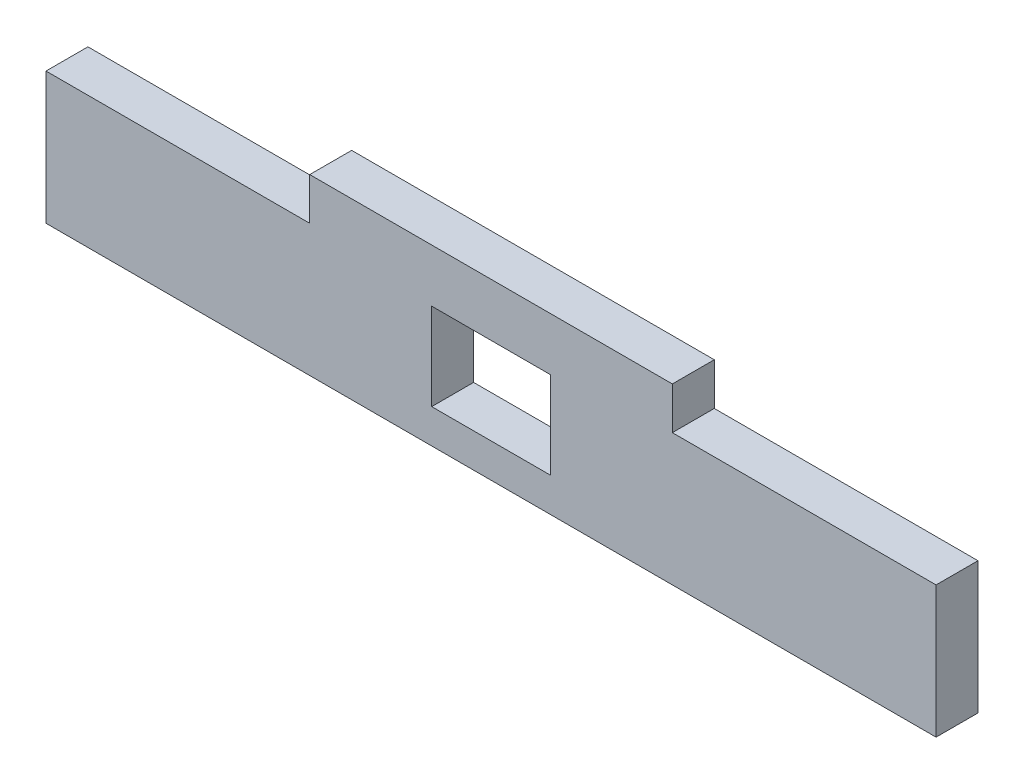
ISO-10303-21;
HEADER;
FILE_DESCRIPTION(('STEP AP214'),'2;1');
FILE_NAME('part.step','',(''),(''),'','','');
FILE_SCHEMA(('AUTOMOTIVE_DESIGN { 1 0 10303 214 1 1 1 1 }'));
ENDSEC;
DATA;
#1=APPLICATION_CONTEXT('core data for automotive mechanical design processes');
#2=APPLICATION_PROTOCOL_DEFINITION('international standard','automotive_design',2000,#1);
#3=PRODUCT_CONTEXT('',#1,'mechanical');
#4=PRODUCT('Part','Part','',(#3));
#5=PRODUCT_RELATED_PRODUCT_CATEGORY('part','',(#4));
#6=PRODUCT_DEFINITION_FORMATION('','',#4);
#7=PRODUCT_DEFINITION_CONTEXT('part definition',#1,'design');
#8=PRODUCT_DEFINITION('design','',#6,#7);
#9=PRODUCT_DEFINITION_SHAPE('','',#8);
#10=(LENGTH_UNIT() NAMED_UNIT(*) SI_UNIT(.MILLI.,.METRE.));
#11=(NAMED_UNIT(*) PLANE_ANGLE_UNIT() SI_UNIT($,.RADIAN.));
#12=(NAMED_UNIT(*) SI_UNIT($,.STERADIAN.) SOLID_ANGLE_UNIT());
#13=UNCERTAINTY_MEASURE_WITH_UNIT(LENGTH_MEASURE(1.E-05),#10,'distance_accuracy_value','');
#14=(GEOMETRIC_REPRESENTATION_CONTEXT(3) GLOBAL_UNCERTAINTY_ASSIGNED_CONTEXT((#13)) GLOBAL_UNIT_ASSIGNED_CONTEXT((#10,
#11,#12)) REPRESENTATION_CONTEXT('',''));
#15=CARTESIAN_POINT('',(0.,0.,0.));
#16=DIRECTION('',(0.,0.,1.));
#17=DIRECTION('',(1.,0.,0.));
#18=AXIS2_PLACEMENT_3D('',#15,#16,#17);
#19=CARTESIAN_POINT('',(0.,0.,4.0386));
#20=DIRECTION('',(0.,0.,1.));
#21=DIRECTION('',(1.,0.,0.));
#22=AXIS2_PLACEMENT_3D('',#19,#20,#21);
#23=PLANE('',#22);
#24=DIRECTION('',(0.,-1.,0.));
#25=VECTOR('',#24,1.);
#26=CARTESIAN_POINT('',(0.,12.7,4.0386));
#27=LINE('',#26,#25);
#28=CARTESIAN_POINT('',(0.,12.7,4.0386));
#29=VERTEX_POINT('',#28);
#30=CARTESIAN_POINT('',(0.,0.,4.0386));
#31=VERTEX_POINT('',#30);
#32=EDGE_CURVE('E158',#29,#31,#27,.T.);
#33=ORIENTED_EDGE('',*,*,#32,.T.);
#34=DIRECTION('',(1.,0.,0.));
#35=VECTOR('',#34,1.);
#36=CARTESIAN_POINT('',(0.,0.,4.0386));
#37=LINE('',#36,#35);
#38=CARTESIAN_POINT('',(85.725,0.,4.0386));
#39=VERTEX_POINT('',#38);
#40=EDGE_CURVE('E161',#31,#39,#37,.T.);
#41=ORIENTED_EDGE('',*,*,#40,.T.);
#42=DIRECTION('',(0.,1.,0.));
#43=VECTOR('',#42,1.);
#44=CARTESIAN_POINT('',(85.725,0.,4.0386));
#45=LINE('',#44,#43);
#46=CARTESIAN_POINT('',(85.725,12.7,4.0386));
#47=VERTEX_POINT('',#46);
#48=EDGE_CURVE('E164',#39,#47,#45,.T.);
#49=ORIENTED_EDGE('',*,*,#48,.T.);
#50=DIRECTION('',(-1.,0.,0.));
#51=VECTOR('',#50,1.);
#52=CARTESIAN_POINT('',(85.725,12.7,4.0386));
#53=LINE('',#52,#51);
#54=CARTESIAN_POINT('',(60.325,12.7,4.0386));
#55=VERTEX_POINT('',#54);
#56=EDGE_CURVE('E166',#47,#55,#53,.T.);
#57=ORIENTED_EDGE('',*,*,#56,.T.);
#58=DIRECTION('',(0.,1.,0.));
#59=VECTOR('',#58,1.);
#60=CARTESIAN_POINT('',(60.325,12.7,4.0386));
#61=LINE('',#60,#59);
#62=CARTESIAN_POINT('',(60.325,16.764,4.0386));
#63=VERTEX_POINT('',#62);
#64=EDGE_CURVE('E168',#55,#63,#61,.T.);
#65=ORIENTED_EDGE('',*,*,#64,.T.);
#66=DIRECTION('',(-1.,0.,0.));
#67=VECTOR('',#66,1.);
#68=CARTESIAN_POINT('',(60.325,16.764,4.0386));
#69=LINE('',#68,#67);
#70=CARTESIAN_POINT('',(25.4,16.764,4.0386));
#71=VERTEX_POINT('',#70);
#72=EDGE_CURVE('E170',#63,#71,#69,.T.);
#73=ORIENTED_EDGE('',*,*,#72,.T.);
#74=DIRECTION('',(0.,-1.,0.));
#75=VECTOR('',#74,1.);
#76=CARTESIAN_POINT('',(25.4,16.764,4.0386));
#77=LINE('',#76,#75);
#78=CARTESIAN_POINT('',(25.4,12.7,4.0386));
#79=VERTEX_POINT('',#78);
#80=EDGE_CURVE('E172',#71,#79,#77,.T.);
#81=ORIENTED_EDGE('',*,*,#80,.T.);
#82=DIRECTION('',(-1.,0.,0.));
#83=VECTOR('',#82,1.);
#84=CARTESIAN_POINT('',(25.4,12.7,4.0386));
#85=LINE('',#84,#83);
#86=EDGE_CURVE('E174',#79,#29,#85,.T.);
#87=ORIENTED_EDGE('',*,*,#86,.T.);
#88=EDGE_LOOP('',(#33,#41,#49,#57,#65,#73,#81,#87));
#89=FACE_BOUND('',#88,.T.);
#90=DIRECTION('',(1.,0.,0.));
#91=VECTOR('',#90,1.);
#92=CARTESIAN_POINT('',(37.1475,3.28290287483415,4.0386));
#93=LINE('',#92,#91);
#94=CARTESIAN_POINT('',(37.1475,3.28290287483415,4.0386));
#95=VERTEX_POINT('',#94);
#96=CARTESIAN_POINT('',(48.5775,3.28290287483415,4.0386));
#97=VERTEX_POINT('',#96);
#98=EDGE_CURVE('E130',#95,#97,#93,.T.);
#99=ORIENTED_EDGE('',*,*,#98,.F.);
#100=DIRECTION('',(0.,-1.,0.));
#101=VECTOR('',#100,1.);
#102=CARTESIAN_POINT('',(37.1475,11.6649028748341,4.0386));
#103=LINE('',#102,#101);
#104=CARTESIAN_POINT('',(37.1475,11.6649028748341,4.0386));
#105=VERTEX_POINT('',#104);
#106=EDGE_CURVE('E122',#105,#95,#103,.T.);
#107=ORIENTED_EDGE('',*,*,#106,.F.);
#108=DIRECTION('',(-1.,0.,0.));
#109=VECTOR('',#108,1.);
#110=CARTESIAN_POINT('',(37.1475,11.6649028748341,4.0386));
#111=LINE('',#110,#109);
#112=CARTESIAN_POINT('',(48.5775,11.6649028748341,4.0386));
#113=VERTEX_POINT('',#112);
#114=EDGE_CURVE('E144',#113,#105,#111,.T.);
#115=ORIENTED_EDGE('',*,*,#114,.F.);
#116=DIRECTION('',(0.,1.,0.));
#117=VECTOR('',#116,1.);
#118=CARTESIAN_POINT('',(48.5775,11.6649028748341,4.0386));
#119=LINE('',#118,#117);
#120=EDGE_CURVE('E142',#97,#113,#119,.T.);
#121=ORIENTED_EDGE('',*,*,#120,.F.);
#122=EDGE_LOOP('',(#99,#107,#115,#121));
#123=FACE_BOUND('',#122,.T.);
#124=ADVANCED_FACE('F33',(#89,#123),#23,.T.);
#125=CARTESIAN_POINT('',(0.,0.,0.));
#126=DIRECTION('',(0.,0.,1.));
#127=DIRECTION('',(1.,0.,0.));
#128=AXIS2_PLACEMENT_3D('',#125,#126,#127);
#129=PLANE('',#128);
#130=DIRECTION('',(0.,-1.,0.));
#131=VECTOR('',#130,1.);
#132=CARTESIAN_POINT('',(0.,12.7,0.));
#133=LINE('',#132,#131);
#134=CARTESIAN_POINT('',(0.,12.7,0.));
#135=VERTEX_POINT('',#134);
#136=CARTESIAN_POINT('',(0.,0.,0.));
#137=VERTEX_POINT('',#136);
#138=EDGE_CURVE('E138',#135,#137,#133,.T.);
#139=ORIENTED_EDGE('',*,*,#138,.F.);
#140=DIRECTION('',(-1.,0.,0.));
#141=VECTOR('',#140,1.);
#142=CARTESIAN_POINT('',(25.4,12.7,0.));
#143=LINE('',#142,#141);
#144=CARTESIAN_POINT('',(25.4,12.7,0.));
#145=VERTEX_POINT('',#144);
#146=EDGE_CURVE('E162',#145,#135,#143,.T.);
#147=ORIENTED_EDGE('',*,*,#146,.F.);
#148=DIRECTION('',(0.,-1.,0.));
#149=VECTOR('',#148,1.);
#150=CARTESIAN_POINT('',(25.4,16.764,0.));
#151=LINE('',#150,#149);
#152=CARTESIAN_POINT('',(25.4,16.764,0.));
#153=VERTEX_POINT('',#152);
#154=EDGE_CURVE('E189',#153,#145,#151,.T.);
#155=ORIENTED_EDGE('',*,*,#154,.F.);
#156=DIRECTION('',(-1.,0.,0.));
#157=VECTOR('',#156,1.);
#158=CARTESIAN_POINT('',(60.325,16.764,0.));
#159=LINE('',#158,#157);
#160=CARTESIAN_POINT('',(60.325,16.764,0.));
#161=VERTEX_POINT('',#160);
#162=EDGE_CURVE('E187',#161,#153,#159,.T.);
#163=ORIENTED_EDGE('',*,*,#162,.F.);
#164=DIRECTION('',(0.,1.,0.));
#165=VECTOR('',#164,1.);
#166=CARTESIAN_POINT('',(60.325,12.7,0.));
#167=LINE('',#166,#165);
#168=CARTESIAN_POINT('',(60.325,12.7,0.));
#169=VERTEX_POINT('',#168);
#170=EDGE_CURVE('E185',#169,#161,#167,.T.);
#171=ORIENTED_EDGE('',*,*,#170,.F.);
#172=DIRECTION('',(-1.,0.,0.));
#173=VECTOR('',#172,1.);
#174=CARTESIAN_POINT('',(85.725,12.7,0.));
#175=LINE('',#174,#173);
#176=CARTESIAN_POINT('',(85.725,12.7,0.));
#177=VERTEX_POINT('',#176);
#178=EDGE_CURVE('E183',#177,#169,#175,.T.);
#179=ORIENTED_EDGE('',*,*,#178,.F.);
#180=DIRECTION('',(0.,1.,0.));
#181=VECTOR('',#180,1.);
#182=CARTESIAN_POINT('',(85.725,0.,0.));
#183=LINE('',#182,#181);
#184=CARTESIAN_POINT('',(85.725,0.,0.));
#185=VERTEX_POINT('',#184);
#186=EDGE_CURVE('E181',#185,#177,#183,.T.);
#187=ORIENTED_EDGE('',*,*,#186,.F.);
#188=DIRECTION('',(1.,0.,0.));
#189=VECTOR('',#188,1.);
#190=CARTESIAN_POINT('',(0.,0.,0.));
#191=LINE('',#190,#189);
#192=EDGE_CURVE('E179',#137,#185,#191,.T.);
#193=ORIENTED_EDGE('',*,*,#192,.F.);
#194=EDGE_LOOP('',(#139,#147,#155,#163,#171,#179,#187,#193));
#195=FACE_BOUND('',#194,.T.);
#196=DIRECTION('',(0.,-1.,0.));
#197=VECTOR('',#196,1.);
#198=CARTESIAN_POINT('',(37.1475,11.6649028748341,0.));
#199=LINE('',#198,#197);
#200=CARTESIAN_POINT('',(37.1475,11.6649028748341,0.));
#201=VERTEX_POINT('',#200);
#202=CARTESIAN_POINT('',(37.1475,3.28290287483415,0.));
#203=VERTEX_POINT('',#202);
#204=EDGE_CURVE('E56',#201,#203,#199,.T.);
#205=ORIENTED_EDGE('',*,*,#204,.T.);
#206=DIRECTION('',(1.,0.,0.));
#207=VECTOR('',#206,1.);
#208=CARTESIAN_POINT('',(37.1475,3.28290287483415,0.));
#209=LINE('',#208,#207);
#210=CARTESIAN_POINT('',(48.5775,3.28290287483415,0.));
#211=VERTEX_POINT('',#210);
#212=EDGE_CURVE('E137',#203,#211,#209,.T.);
#213=ORIENTED_EDGE('',*,*,#212,.T.);
#214=DIRECTION('',(0.,1.,0.));
#215=VECTOR('',#214,1.);
#216=CARTESIAN_POINT('',(48.5775,11.6649028748341,0.));
#217=LINE('',#216,#215);
#218=CARTESIAN_POINT('',(48.5775,11.6649028748341,0.));
#219=VERTEX_POINT('',#218);
#220=EDGE_CURVE('E150',#211,#219,#217,.T.);
#221=ORIENTED_EDGE('',*,*,#220,.T.);
#222=DIRECTION('',(-1.,0.,0.));
#223=VECTOR('',#222,1.);
#224=CARTESIAN_POINT('',(37.1475,11.6649028748341,0.));
#225=LINE('',#224,#223);
#226=EDGE_CURVE('E131',#219,#201,#225,.T.);
#227=ORIENTED_EDGE('',*,*,#226,.T.);
#228=EDGE_LOOP('',(#205,#213,#221,#227));
#229=FACE_BOUND('',#228,.T.);
#230=ADVANCED_FACE('F219',(#195,#229),#129,.F.);
#231=CARTESIAN_POINT('',(0.,12.7,4.0386));
#232=DIRECTION('',(1.,0.,0.));
#233=DIRECTION('',(0.,0.,-1.));
#234=AXIS2_PLACEMENT_3D('',#231,#232,#233);
#235=PLANE('',#234);
#236=ORIENTED_EDGE('',*,*,#138,.T.);
#237=DIRECTION('',(0.,0.,-1.));
#238=VECTOR('',#237,1.);
#239=CARTESIAN_POINT('',(0.,0.,4.0386));
#240=LINE('',#239,#238);
#241=EDGE_CURVE('E11',#31,#137,#240,.T.);
#242=ORIENTED_EDGE('',*,*,#241,.F.);
#243=ORIENTED_EDGE('',*,*,#32,.F.);
#244=DIRECTION('',(0.,0.,-1.));
#245=VECTOR('',#244,1.);
#246=CARTESIAN_POINT('',(0.,12.7,4.0386));
#247=LINE('',#246,#245);
#248=EDGE_CURVE('E176',#29,#135,#247,.T.);
#249=ORIENTED_EDGE('',*,*,#248,.T.);
#250=EDGE_LOOP('',(#236,#242,#243,#249));
#251=FACE_BOUND('',#250,.T.);
#252=ADVANCED_FACE('F35',(#251),#235,.F.);
#253=CARTESIAN_POINT('',(0.,0.,4.0386));
#254=DIRECTION('',(0.,1.,0.));
#255=DIRECTION('',(0.,0.,1.));
#256=AXIS2_PLACEMENT_3D('',#253,#254,#255);
#257=PLANE('',#256);
#258=ORIENTED_EDGE('',*,*,#192,.T.);
#259=DIRECTION('',(0.,0.,-1.));
#260=VECTOR('',#259,1.);
#261=CARTESIAN_POINT('',(85.725,0.,4.0386));
#262=LINE('',#261,#260);
#263=EDGE_CURVE('E41',#39,#185,#262,.T.);
#264=ORIENTED_EDGE('',*,*,#263,.F.);
#265=ORIENTED_EDGE('',*,*,#40,.F.);
#266=ORIENTED_EDGE('',*,*,#241,.T.);
#267=EDGE_LOOP('',(#258,#264,#265,#266));
#268=FACE_BOUND('',#267,.T.);
#269=ADVANCED_FACE('F236',(#268),#257,.F.);
#270=CARTESIAN_POINT('',(85.725,0.,4.0386));
#271=DIRECTION('',(-1.,0.,0.));
#272=DIRECTION('',(0.,0.,1.));
#273=AXIS2_PLACEMENT_3D('',#270,#271,#272);
#274=PLANE('',#273);
#275=ORIENTED_EDGE('',*,*,#186,.T.);
#276=DIRECTION('',(0.,0.,-1.));
#277=VECTOR('',#276,1.);
#278=CARTESIAN_POINT('',(85.725,12.7,4.0386));
#279=LINE('',#278,#277);
#280=EDGE_CURVE('E206',#47,#177,#279,.T.);
#281=ORIENTED_EDGE('',*,*,#280,.F.);
#282=ORIENTED_EDGE('',*,*,#48,.F.);
#283=ORIENTED_EDGE('',*,*,#263,.T.);
#284=EDGE_LOOP('',(#275,#281,#282,#283));
#285=FACE_BOUND('',#284,.T.);
#286=ADVANCED_FACE('F213',(#285),#274,.F.);
#287=CARTESIAN_POINT('',(85.725,12.7,4.0386));
#288=DIRECTION('',(0.,-1.,0.));
#289=DIRECTION('',(0.,0.,-1.));
#290=AXIS2_PLACEMENT_3D('',#287,#288,#289);
#291=PLANE('',#290);
#292=ORIENTED_EDGE('',*,*,#178,.T.);
#293=DIRECTION('',(0.,0.,-1.));
#294=VECTOR('',#293,1.);
#295=CARTESIAN_POINT('',(60.325,12.7,4.0386));
#296=LINE('',#295,#294);
#297=EDGE_CURVE('E203',#55,#169,#296,.T.);
#298=ORIENTED_EDGE('',*,*,#297,.F.);
#299=ORIENTED_EDGE('',*,*,#56,.F.);
#300=ORIENTED_EDGE('',*,*,#280,.T.);
#301=EDGE_LOOP('',(#292,#298,#299,#300));
#302=FACE_BOUND('',#301,.T.);
#303=ADVANCED_FACE('F225',(#302),#291,.F.);
#304=CARTESIAN_POINT('',(60.325,12.7,4.0386));
#305=DIRECTION('',(-1.,0.,0.));
#306=DIRECTION('',(0.,0.,1.));
#307=AXIS2_PLACEMENT_3D('',#304,#305,#306);
#308=PLANE('',#307);
#309=ORIENTED_EDGE('',*,*,#170,.T.);
#310=DIRECTION('',(0.,0.,-1.));
#311=VECTOR('',#310,1.);
#312=CARTESIAN_POINT('',(60.325,16.764,4.0386));
#313=LINE('',#312,#311);
#314=EDGE_CURVE('E200',#63,#161,#313,.T.);
#315=ORIENTED_EDGE('',*,*,#314,.F.);
#316=ORIENTED_EDGE('',*,*,#64,.F.);
#317=ORIENTED_EDGE('',*,*,#297,.T.);
#318=EDGE_LOOP('',(#309,#315,#316,#317));
#319=FACE_BOUND('',#318,.T.);
#320=ADVANCED_FACE('F229',(#319),#308,.F.);
#321=CARTESIAN_POINT('',(60.325,16.764,4.0386));
#322=DIRECTION('',(0.,-1.,0.));
#323=DIRECTION('',(1.,0.,0.));
#324=AXIS2_PLACEMENT_3D('',#321,#322,#323);
#325=PLANE('',#324);
#326=ORIENTED_EDGE('',*,*,#162,.T.);
#327=DIRECTION('',(0.,0.,-1.));
#328=VECTOR('',#327,1.);
#329=CARTESIAN_POINT('',(25.4,16.764,4.0386));
#330=LINE('',#329,#328);
#331=EDGE_CURVE('E197',#71,#153,#330,.T.);
#332=ORIENTED_EDGE('',*,*,#331,.F.);
#333=ORIENTED_EDGE('',*,*,#72,.F.);
#334=ORIENTED_EDGE('',*,*,#314,.T.);
#335=EDGE_LOOP('',(#326,#332,#333,#334));
#336=FACE_BOUND('',#335,.T.);
#337=ADVANCED_FACE('F249',(#336),#325,.F.);
#338=CARTESIAN_POINT('',(25.4,16.764,4.0386));
#339=DIRECTION('',(1.,0.,0.));
#340=DIRECTION('',(0.,1.,0.));
#341=AXIS2_PLACEMENT_3D('',#338,#339,#340);
#342=PLANE('',#341);
#343=ORIENTED_EDGE('',*,*,#154,.T.);
#344=DIRECTION('',(0.,0.,-1.));
#345=VECTOR('',#344,1.);
#346=CARTESIAN_POINT('',(25.4,12.7,4.0386));
#347=LINE('',#346,#345);
#348=EDGE_CURVE('E194',#79,#145,#347,.T.);
#349=ORIENTED_EDGE('',*,*,#348,.F.);
#350=ORIENTED_EDGE('',*,*,#80,.F.);
#351=ORIENTED_EDGE('',*,*,#331,.T.);
#352=EDGE_LOOP('',(#343,#349,#350,#351));
#353=FACE_BOUND('',#352,.T.);
#354=ADVANCED_FACE('F247',(#353),#342,.F.);
#355=CARTESIAN_POINT('',(25.4,12.7,4.0386));
#356=DIRECTION('',(0.,-1.,0.));
#357=DIRECTION('',(0.,0.,-1.));
#358=AXIS2_PLACEMENT_3D('',#355,#356,#357);
#359=PLANE('',#358);
#360=ORIENTED_EDGE('',*,*,#146,.T.);
#361=ORIENTED_EDGE('',*,*,#248,.F.);
#362=ORIENTED_EDGE('',*,*,#86,.F.);
#363=ORIENTED_EDGE('',*,*,#348,.T.);
#364=EDGE_LOOP('',(#360,#361,#362,#363));
#365=FACE_BOUND('',#364,.T.);
#366=ADVANCED_FACE('F242',(#365),#359,.F.);
#367=CARTESIAN_POINT('',(37.1475,11.6649028748341,4.0386));
#368=DIRECTION('',(1.,0.,0.));
#369=DIRECTION('',(0.,0.,-1.));
#370=AXIS2_PLACEMENT_3D('',#367,#368,#369);
#371=PLANE('',#370);
#372=ORIENTED_EDGE('',*,*,#204,.F.);
#373=DIRECTION('',(0.,0.,-1.));
#374=VECTOR('',#373,1.);
#375=CARTESIAN_POINT('',(37.1475,11.6649028748341,4.0386));
#376=LINE('',#375,#374);
#377=EDGE_CURVE('E126',#105,#201,#376,.T.);
#378=ORIENTED_EDGE('',*,*,#377,.F.);
#379=ORIENTED_EDGE('',*,*,#106,.T.);
#380=DIRECTION('',(0.,0.,-1.));
#381=VECTOR('',#380,1.);
#382=CARTESIAN_POINT('',(37.1475,3.28290287483415,4.0386));
#383=LINE('',#382,#381);
#384=EDGE_CURVE('E125',#95,#203,#383,.T.);
#385=ORIENTED_EDGE('',*,*,#384,.T.);
#386=EDGE_LOOP('',(#372,#378,#379,#385));
#387=FACE_BOUND('',#386,.T.);
#388=ADVANCED_FACE('F124',(#387),#371,.T.);
#389=CARTESIAN_POINT('',(37.1475,3.28290287483415,4.0386));
#390=DIRECTION('',(0.,1.,0.));
#391=DIRECTION('',(0.,0.,1.));
#392=AXIS2_PLACEMENT_3D('',#389,#390,#391);
#393=PLANE('',#392);
#394=ORIENTED_EDGE('',*,*,#212,.F.);
#395=ORIENTED_EDGE('',*,*,#384,.F.);
#396=ORIENTED_EDGE('',*,*,#98,.T.);
#397=DIRECTION('',(0.,0.,-1.));
#398=VECTOR('',#397,1.);
#399=CARTESIAN_POINT('',(48.5775,3.28290287483415,4.0386));
#400=LINE('',#399,#398);
#401=EDGE_CURVE('E139',#97,#211,#400,.T.);
#402=ORIENTED_EDGE('',*,*,#401,.T.);
#403=EDGE_LOOP('',(#394,#395,#396,#402));
#404=FACE_BOUND('',#403,.T.);
#405=ADVANCED_FACE('F134',(#404),#393,.T.);
#406=CARTESIAN_POINT('',(48.5775,11.6649028748341,4.0386));
#407=DIRECTION('',(-1.,0.,0.));
#408=DIRECTION('',(0.,0.,1.));
#409=AXIS2_PLACEMENT_3D('',#406,#407,#408);
#410=PLANE('',#409);
#411=ORIENTED_EDGE('',*,*,#220,.F.);
#412=ORIENTED_EDGE('',*,*,#401,.F.);
#413=ORIENTED_EDGE('',*,*,#120,.T.);
#414=DIRECTION('',(0.,0.,-1.));
#415=VECTOR('',#414,1.);
#416=CARTESIAN_POINT('',(48.5775,11.6649028748341,4.0386));
#417=LINE('',#416,#415);
#418=EDGE_CURVE('E48',#113,#219,#417,.T.);
#419=ORIENTED_EDGE('',*,*,#418,.T.);
#420=EDGE_LOOP('',(#411,#412,#413,#419));
#421=FACE_BOUND('',#420,.T.);
#422=ADVANCED_FACE('F274',(#421),#410,.T.);
#423=CARTESIAN_POINT('',(37.1475,11.6649028748341,4.0386));
#424=DIRECTION('',(0.,-1.,0.));
#425=DIRECTION('',(0.,0.,-1.));
#426=AXIS2_PLACEMENT_3D('',#423,#424,#425);
#427=PLANE('',#426);
#428=ORIENTED_EDGE('',*,*,#226,.F.);
#429=ORIENTED_EDGE('',*,*,#418,.F.);
#430=ORIENTED_EDGE('',*,*,#114,.T.);
#431=ORIENTED_EDGE('',*,*,#377,.T.);
#432=EDGE_LOOP('',(#428,#429,#430,#431));
#433=FACE_BOUND('',#432,.T.);
#434=ADVANCED_FACE('F278',(#433),#427,.T.);
#435=CLOSED_SHELL('',(#124,#230,#252,#269,#286,#303,#320,#337,#354,#366,#388,#405,#422,#434));
#436=MANIFOLD_SOLID_BREP('B2',#435);
#437=ADVANCED_BREP_SHAPE_REPRESENTATION('',(#18,#436),#14);
#438=SHAPE_DEFINITION_REPRESENTATION(#9,#437);
ENDSEC;
END-ISO-10303-21;
